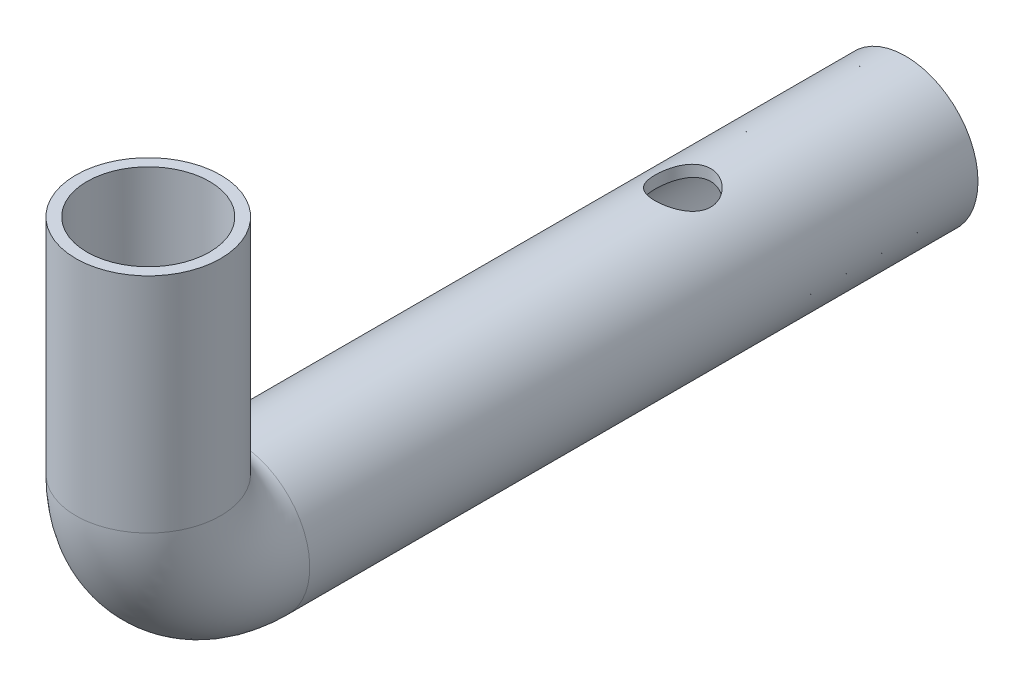
ISO-10303-21;
HEADER;
FILE_DESCRIPTION(('STEP AP214'),'2;1');
FILE_NAME('part.step','',(''),(''),'','','');
FILE_SCHEMA(('AUTOMOTIVE_DESIGN { 1 0 10303 214 1 1 1 1 }'));
ENDSEC;
DATA;
#1=APPLICATION_CONTEXT('core data for automotive mechanical design processes');
#2=APPLICATION_PROTOCOL_DEFINITION('international standard','automotive_design',2000,#1);
#3=PRODUCT_CONTEXT('',#1,'mechanical');
#4=PRODUCT('Part','Part','',(#3));
#5=PRODUCT_RELATED_PRODUCT_CATEGORY('part','',(#4));
#6=PRODUCT_DEFINITION_FORMATION('','',#4);
#7=PRODUCT_DEFINITION_CONTEXT('part definition',#1,'design');
#8=PRODUCT_DEFINITION('design','',#6,#7);
#9=PRODUCT_DEFINITION_SHAPE('','',#8);
#10=(LENGTH_UNIT() NAMED_UNIT(*) SI_UNIT(.MILLI.,.METRE.));
#11=(NAMED_UNIT(*) PLANE_ANGLE_UNIT() SI_UNIT($,.RADIAN.));
#12=(NAMED_UNIT(*) SI_UNIT($,.STERADIAN.) SOLID_ANGLE_UNIT());
#13=UNCERTAINTY_MEASURE_WITH_UNIT(LENGTH_MEASURE(1.E-05),#10,'distance_accuracy_value','');
#14=(GEOMETRIC_REPRESENTATION_CONTEXT(3) GLOBAL_UNCERTAINTY_ASSIGNED_CONTEXT((#13)) GLOBAL_UNIT_ASSIGNED_CONTEXT((#10,
#11,#12)) REPRESENTATION_CONTEXT('',''));
#15=CARTESIAN_POINT('',(0.,0.,0.));
#16=DIRECTION('',(0.,0.,1.));
#17=DIRECTION('',(1.,0.,0.));
#18=AXIS2_PLACEMENT_3D('',#15,#16,#17);
#19=CARTESIAN_POINT('',(0.,0.,0.));
#20=DIRECTION('',(0.,0.,1.));
#21=DIRECTION('',(0.,-1.,0.));
#22=AXIS2_PLACEMENT_3D('',#19,#20,#21);
#23=CYLINDRICAL_SURFACE('',#22,6.5);
#24=CARTESIAN_POINT('',(0.,0.,60.));
#25=DIRECTION('',(0.,0.,-1.));
#26=DIRECTION('',(0.,1.,0.));
#27=AXIS2_PLACEMENT_3D('',#24,#25,#26);
#28=CIRCLE('',#27,6.5);
#29=CARTESIAN_POINT('',(0.,-6.50000000000001,60.));
#30=VERTEX_POINT('',#29);
#31=EDGE_CURVE('E77',#30,#30,#28,.T.);
#32=ORIENTED_EDGE('',*,*,#31,.T.);
#33=EDGE_LOOP('',(#32));
#34=FACE_BOUND('',#33,.T.);
#35=CARTESIAN_POINT('',(0.,0.,0.));
#36=DIRECTION('',(0.,0.,-1.));
#37=DIRECTION('',(0.,1.,0.));
#38=AXIS2_PLACEMENT_3D('',#35,#36,#37);
#39=CIRCLE('',#38,6.5);
#40=CARTESIAN_POINT('',(0.,6.5,0.));
#41=VERTEX_POINT('',#40);
#42=EDGE_CURVE('E138',#41,#41,#39,.T.);
#43=ORIENTED_EDGE('',*,*,#42,.F.);
#44=EDGE_LOOP('',(#43));
#45=FACE_BOUND('',#44,.T.);
#46=CARTESIAN_POINT('',(0.,-6.5,17.5));
#47=CARTESIAN_POINT('',(0.13514306397447,-6.500004629863,17.4999939273656));
#48=CARTESIAN_POINT('',(0.270245683690177,-6.49574921829708,17.5109920103322));
#49=CARTESIAN_POINT('',(0.536399893676355,-6.47920060501405,17.5545046796923));
#50=CARTESIAN_POINT('',(0.667452289329331,-6.46690901219325,17.5870149592184));
#51=CARTESIAN_POINT('',(0.9216280032252,-6.43560329326638,17.6722230931575));
#52=CARTESIAN_POINT('',(1.04476653465277,-6.41660255099367,17.7248807736205));
#53=CARTESIAN_POINT('',(1.28044908901321,-6.3737599269311,17.8486790867224));
#54=CARTESIAN_POINT('',(1.39299010958969,-6.34991667922571,17.919824935867));
#55=CARTESIAN_POINT('',(1.60927258674544,-6.29865787982818,18.0818695715037));
#56=CARTESIAN_POINT('',(1.71248272971103,-6.27113765392606,18.1734440616638));
#57=CARTESIAN_POINT('',(1.90251373412529,-6.21612788263757,18.3723120888079));
#58=CARTESIAN_POINT('',(1.98932919333357,-6.18863835032093,18.4796107864902));
#59=CARTESIAN_POINT('',(2.14757341678641,-6.13556746669898,18.7121749791886));
#60=CARTESIAN_POINT('',(2.21823663101441,-6.11010848455126,18.8379921285933));
#61=CARTESIAN_POINT('',(2.33716189177337,-6.06561918541038,19.1008566598219));
#62=CARTESIAN_POINT('',(2.38543341568332,-6.04658614953798,19.2378992614743));
#63=CARTESIAN_POINT('',(2.45608262902037,-6.01822730812514,19.513196736226));
#64=CARTESIAN_POINT('',(2.47947801200992,-6.00852169181304,19.6511499533078));
#65=CARTESIAN_POINT('',(2.50289199475193,-5.99880894830526,19.929339459977));
#66=CARTESIAN_POINT('',(2.50292090442516,-5.99879754376073,20.0695747153534));
#67=CARTESIAN_POINT('',(2.48037656312943,-6.00814837573631,20.3388642581518));
#68=CARTESIAN_POINT('',(2.45923795706445,-6.01691562933088,20.4680632129148));
#69=CARTESIAN_POINT('',(2.39733806133434,-6.04184340382832,20.7209150794066));
#70=CARTESIAN_POINT('',(2.35657365742926,-6.05800509806771,20.8445671075386));
#71=CARTESIAN_POINT('',(2.25582663922901,-6.09624370169108,21.0856583117823));
#72=CARTESIAN_POINT('',(2.19548450476653,-6.1184298919496,21.2029291522169));
#73=CARTESIAN_POINT('',(2.05754611602823,-6.16618367671209,21.4260878785016));
#74=CARTESIAN_POINT('',(1.97994369235949,-6.19175247894498,21.5319716741229));
#75=CARTESIAN_POINT('',(1.80320515332933,-6.24560345180463,21.7372591612457));
#76=CARTESIAN_POINT('',(1.70293144449403,-6.27394938839792,21.83566921961));
#77=CARTESIAN_POINT('',(1.48698639045576,-6.32860686825818,22.0145806692835));
#78=CARTESIAN_POINT('',(1.37131243202998,-6.35491806505566,22.0950790150006));
#79=CARTESIAN_POINT('',(1.12520910755081,-6.4031140673231,22.2370550482149));
#80=CARTESIAN_POINT('',(0.994562099156594,-6.42491590699446,22.2981856575932));
#81=CARTESIAN_POINT('',(0.723789666413505,-6.46101701436,22.3972661025489));
#82=CARTESIAN_POINT('',(0.583668713964964,-6.47531979423949,22.4352267911306));
#83=CARTESIAN_POINT('',(0.306275874042356,-6.49418523125043,22.4849421817623));
#84=CARTESIAN_POINT('',(0.16927717725372,-6.49924422048434,22.4980338789584));
#85=CARTESIAN_POINT('',(-0.105038056069671,-6.50059706095232,22.5015534380367));
#86=CARTESIAN_POINT('',(-0.242354510117281,-6.49689297696438,22.491986638772));
#87=CARTESIAN_POINT('',(-0.507523391484589,-6.4814625265296,22.4514649156598));
#88=CARTESIAN_POINT('',(-0.635533278632625,-6.47007006377642,22.4213996939687));
#89=CARTESIAN_POINT('',(-0.884591112419543,-6.44074795216429,22.3419207694987));
#90=CARTESIAN_POINT('',(-1.0056381538334,-6.42281745552311,22.2925045574291));
#91=CARTESIAN_POINT('',(-1.24139762727352,-6.38151162872813,22.1741323847667));
#92=CARTESIAN_POINT('',(-1.35581229097729,-6.35798948099244,22.1046361856224));
#93=CARTESIAN_POINT('',(-1.57174720946057,-6.30808313000719,21.9486828718725));
#94=CARTESIAN_POINT('',(-1.67326251243974,-6.28169783481671,21.8622192760433));
#95=CARTESIAN_POINT('',(-1.86700866345895,-6.22695982329863,21.6685802493167));
#96=CARTESIAN_POINT('',(-1.95829399903938,-6.19858535620119,21.5604624610308));
#97=CARTESIAN_POINT('',(-2.12162980756564,-6.14459987855307,21.329904597358));
#98=CARTESIAN_POINT('',(-2.19367804771028,-6.11898918899244,21.2074628617964));
#99=CARTESIAN_POINT('',(-2.31670165885943,-6.07348698871133,20.950423952603));
#100=CARTESIAN_POINT('',(-2.36754575072591,-6.05363133271637,20.8157571607653));
#101=CARTESIAN_POINT('',(-2.44547862786552,-6.02257652756719,20.5387893944966));
#102=CARTESIAN_POINT('',(-2.47258316364823,-6.01137163946424,20.39649354834));
#103=CARTESIAN_POINT('',(-2.50082210532946,-5.99967502686126,20.1186113991318));
#104=CARTESIAN_POINT('',(-2.50357962943263,-5.99851384313484,19.9832169809304));
#105=CARTESIAN_POINT('',(-2.48724412852084,-6.00530547478505,19.7139989075653));
#106=CARTESIAN_POINT('',(-2.4681534084365,-6.01325732876099,19.5801750882123));
#107=CARTESIAN_POINT('',(-2.40995136741685,-6.03680892276013,19.3225039371973));
#108=CARTESIAN_POINT('',(-2.37153828396777,-6.05214118297217,19.1984722976881));
#109=CARTESIAN_POINT('',(-2.27641115159598,-6.08855756315716,18.9585502065407));
#110=CARTESIAN_POINT('',(-2.21969236739862,-6.1096431711739,18.8426618708484));
#111=CARTESIAN_POINT('',(-2.08599319505102,-6.15661478314378,18.6154646964258));
#112=CARTESIAN_POINT('',(-2.00807939428015,-6.18269935662048,18.5047467585243));
#113=CARTESIAN_POINT('',(-1.83561573990325,-6.23607706100414,18.297440282091));
#114=CARTESIAN_POINT('',(-1.74106046198839,-6.2633705837922,18.2008563694186));
#115=CARTESIAN_POINT('',(-1.53143830219016,-6.31799605166972,18.018824624031));
#116=CARTESIAN_POINT('',(-1.41549882935315,-6.34523808084889,17.9343499410604));
#117=CARTESIAN_POINT('',(-1.17010716237063,-6.39503827616325,17.7860891403572));
#118=CARTESIAN_POINT('',(-1.04065270472818,-6.41759565581366,17.7223064955093));
#119=CARTESIAN_POINT('',(-0.762900842232431,-6.4566913943766,17.6142955809813));
#120=CARTESIAN_POINT('',(-0.613925037531385,-6.47274070554298,17.571615623945));
#121=CARTESIAN_POINT('',(-0.309946097844235,-6.49438936244195,17.5144793950754));
#122=CARTESIAN_POINT('',(-0.154946466000344,-6.49999469169273,17.5000069624975));
#123=CARTESIAN_POINT('',(0.,-6.5,17.5));
#124=B_SPLINE_CURVE_WITH_KNOTS('',3,(#46,#47,#48,#49,#50,#51,#52,#53,#54,#55,#56,#57,#58,#59,
#60,#61,#62,#63,#64,#65,#66,#67,#68,#69,#70,#71,#72,#73,#74,#75,#76,#77,#78,#79,#80,#81,#82,#83,
#84,#85,#86,#87,#88,#89,#90,#91,#92,#93,#94,#95,#96,#97,#98,#99,#100,#101,#102,#103,#104,#105,
#106,#107,#108,#109,#110,#111,#112,#113,#114,#115,#116,#117,#118,#119,#120,#121,#122,#123),
.UNSPECIFIED.,.T.,.F.,(4,2,2,2,2,2,2,2,2,2,2,2,2,2,2,2,2,2,2,2,2,2,2,2,2,2,2,2,2,2,2,2,2,2,2,2,
2,2,4),(0.,0.404857395673177,0.809633761045267,1.21360717298344,1.61769469151936,
2.03792903302866,2.45830160597868,2.89569907712733,3.33291124861789,3.75145366078396,
4.16981140060331,4.56161223088491,4.95347525299002,5.35298551114875,5.75263879750164,
6.18066348321894,6.60876089197115,7.04414506400745,7.47932514126757,7.89036278979613,
8.30130359821627,8.6954568641467,9.08966125783838,9.4956566096056,9.90180734683234,
10.3327599285419,10.7637625081092,11.1973952581665,11.6307400870075,12.0349578310579,
12.4391329351611,12.8296520191847,13.2202722028207,13.6321153154032,14.0440929181879,
14.4800085178991,14.9159972424678,15.3804472276237,15.8446310403091),.UNSPECIFIED.);
#125=CARTESIAN_POINT('',(0.,-6.5,17.5));
#126=VERTEX_POINT('',#125);
#127=EDGE_CURVE('E106',#126,#126,#124,.T.);
#128=ORIENTED_EDGE('',*,*,#127,.F.);
#129=EDGE_LOOP('',(#128));
#130=FACE_BOUND('',#129,.T.);
#131=CARTESIAN_POINT('',(0.,6.5,17.5));
#132=CARTESIAN_POINT('',(-0.13514306397447,6.50000462986299,17.4999939273656));
#133=CARTESIAN_POINT('',(-0.270245683690178,6.49574921829707,17.5109920103322));
#134=CARTESIAN_POINT('',(-0.536399893676355,6.47920060501405,17.5545046796923));
#135=CARTESIAN_POINT('',(-0.667452289329332,6.46690901219325,17.5870149592184));
#136=CARTESIAN_POINT('',(-0.921628003225201,6.43560329326637,17.6722230931575));
#137=CARTESIAN_POINT('',(-1.04476653465277,6.41660255099367,17.7248807736205));
#138=CARTESIAN_POINT('',(-1.28044908901321,6.3737599269311,17.8486790867224));
#139=CARTESIAN_POINT('',(-1.39299010958969,6.34991667922571,17.919824935867));
#140=CARTESIAN_POINT('',(-1.60927258674544,6.29865787982817,18.0818695715037));
#141=CARTESIAN_POINT('',(-1.71248272971103,6.27113765392606,18.1734440616638));
#142=CARTESIAN_POINT('',(-1.90251373412529,6.21612788263757,18.3723120888079));
#143=CARTESIAN_POINT('',(-1.98932919333357,6.18863835032093,18.4796107864902));
#144=CARTESIAN_POINT('',(-2.14757341678641,6.13556746669897,18.7121749791886));
#145=CARTESIAN_POINT('',(-2.21823663101441,6.11010848455125,18.8379921285933));
#146=CARTESIAN_POINT('',(-2.33716189177337,6.06561918541038,19.1008566598219));
#147=CARTESIAN_POINT('',(-2.38543341568332,6.04658614953798,19.2378992614743));
#148=CARTESIAN_POINT('',(-2.45608262902037,6.01822730812514,19.513196736226));
#149=CARTESIAN_POINT('',(-2.47947801200992,6.00852169181304,19.6511499533078));
#150=CARTESIAN_POINT('',(-2.50289199475193,5.99880894830526,19.929339459977));
#151=CARTESIAN_POINT('',(-2.50292090442516,5.99879754376073,20.0695747153534));
#152=CARTESIAN_POINT('',(-2.48037656312943,6.0081483757363,20.3388642581518));
#153=CARTESIAN_POINT('',(-2.45923795706445,6.01691562933087,20.4680632129148));
#154=CARTESIAN_POINT('',(-2.39733806133434,6.04184340382831,20.7209150794066));
#155=CARTESIAN_POINT('',(-2.35657365742926,6.05800509806771,20.8445671075386));
#156=CARTESIAN_POINT('',(-2.25582663922901,6.09624370169107,21.0856583117823));
#157=CARTESIAN_POINT('',(-2.19548450476653,6.11842989194959,21.2029291522169));
#158=CARTESIAN_POINT('',(-2.05754611602823,6.16618367671208,21.4260878785016));
#159=CARTESIAN_POINT('',(-1.97994369235949,6.19175247894497,21.5319716741229));
#160=CARTESIAN_POINT('',(-1.80320515332933,6.24560345180462,21.7372591612457));
#161=CARTESIAN_POINT('',(-1.70293144449403,6.27394938839791,21.83566921961));
#162=CARTESIAN_POINT('',(-1.48698639045577,6.32860686825818,22.0145806692835));
#163=CARTESIAN_POINT('',(-1.37131243202998,6.35491806505565,22.0950790150006));
#164=CARTESIAN_POINT('',(-1.12520910755081,6.40311406732309,22.2370550482149));
#165=CARTESIAN_POINT('',(-0.994562099156594,6.42491590699446,22.2981856575932));
#166=CARTESIAN_POINT('',(-0.723789666413505,6.46101701436,22.3972661025489));
#167=CARTESIAN_POINT('',(-0.583668713964963,6.47531979423948,22.4352267911306));
#168=CARTESIAN_POINT('',(-0.306275874042356,6.49418523125042,22.4849421817623));
#169=CARTESIAN_POINT('',(-0.16927717725372,6.49924422048433,22.4980338789584));
#170=CARTESIAN_POINT('',(0.105038056069671,6.50059706095231,22.5015534380367));
#171=CARTESIAN_POINT('',(0.242354510117282,6.49689297696437,22.491986638772));
#172=CARTESIAN_POINT('',(0.50752339148459,6.48146252652959,22.4514649156598));
#173=CARTESIAN_POINT('',(0.635533278632626,6.47007006377642,22.4213996939687));
#174=CARTESIAN_POINT('',(0.884591112419543,6.44074795216429,22.3419207694987));
#175=CARTESIAN_POINT('',(1.0056381538334,6.4228174555231,22.2925045574291));
#176=CARTESIAN_POINT('',(1.24139762727352,6.38151162872812,22.1741323847667));
#177=CARTESIAN_POINT('',(1.35581229097729,6.35798948099243,22.1046361856224));
#178=CARTESIAN_POINT('',(1.57174720946057,6.30808313000719,21.9486828718725));
#179=CARTESIAN_POINT('',(1.67326251243974,6.28169783481671,21.8622192760433));
#180=CARTESIAN_POINT('',(1.86700866345895,6.22695982329862,21.6685802493167));
#181=CARTESIAN_POINT('',(1.95829399903938,6.19858535620119,21.5604624610308));
#182=CARTESIAN_POINT('',(2.12162980756564,6.14459987855306,21.329904597358));
#183=CARTESIAN_POINT('',(2.19367804771028,6.11898918899243,21.2074628617964));
#184=CARTESIAN_POINT('',(2.31670165885943,6.07348698871133,20.950423952603));
#185=CARTESIAN_POINT('',(2.36754575072591,6.05363133271636,20.8157571607653));
#186=CARTESIAN_POINT('',(2.44547862786552,6.02257652756718,20.5387893944966));
#187=CARTESIAN_POINT('',(2.47258316364823,6.01137163946424,20.39649354834));
#188=CARTESIAN_POINT('',(2.50082210532946,5.99967502686125,20.1186113991318));
#189=CARTESIAN_POINT('',(2.50357962943263,5.99851384313483,19.9832169809304));
#190=CARTESIAN_POINT('',(2.48724412852084,6.00530547478504,19.7139989075653));
#191=CARTESIAN_POINT('',(2.4681534084365,6.01325732876098,19.5801750882123));
#192=CARTESIAN_POINT('',(2.40995136741685,6.03680892276012,19.3225039371973));
#193=CARTESIAN_POINT('',(2.37153828396777,6.05214118297217,19.1984722976881));
#194=CARTESIAN_POINT('',(2.27641115159598,6.08855756315716,18.9585502065407));
#195=CARTESIAN_POINT('',(2.21969236739862,6.10964317117389,18.8426618708484));
#196=CARTESIAN_POINT('',(2.08599319505102,6.15661478314377,18.6154646964258));
#197=CARTESIAN_POINT('',(2.00807939428015,6.18269935662047,18.5047467585243));
#198=CARTESIAN_POINT('',(1.83561573990325,6.23607706100413,18.297440282091));
#199=CARTESIAN_POINT('',(1.74106046198838,6.2633705837922,18.2008563694186));
#200=CARTESIAN_POINT('',(1.53143830219016,6.31799605166971,18.018824624031));
#201=CARTESIAN_POINT('',(1.41549882935314,6.34523808084888,17.9343499410604));
#202=CARTESIAN_POINT('',(1.17010716237063,6.39503827616325,17.7860891403572));
#203=CARTESIAN_POINT('',(1.04065270472818,6.41759565581366,17.7223064955093));
#204=CARTESIAN_POINT('',(0.762900842232431,6.4566913943766,17.6142955809813));
#205=CARTESIAN_POINT('',(0.613925037531385,6.47274070554298,17.571615623945));
#206=CARTESIAN_POINT('',(0.309946097844235,6.49438936244195,17.5144793950754));
#207=CARTESIAN_POINT('',(0.154946466000344,6.49999469169272,17.5000069624975));
#208=CARTESIAN_POINT('',(0.,6.5,17.5));
#209=B_SPLINE_CURVE_WITH_KNOTS('',3,(#131,#132,#133,#134,#135,#136,#137,#138,#139,#140,#141,
#142,#143,#144,#145,#146,#147,#148,#149,#150,#151,#152,#153,#154,#155,#156,#157,#158,#159,#160,
#161,#162,#163,#164,#165,#166,#167,#168,#169,#170,#171,#172,#173,#174,#175,#176,#177,#178,#179,
#180,#181,#182,#183,#184,#185,#186,#187,#188,#189,#190,#191,#192,#193,#194,#195,#196,#197,#198,
#199,#200,#201,#202,#203,#204,#205,#206,#207,#208),.UNSPECIFIED.,.T.,.F.,(4,2,2,2,2,2,2,2,2,2,2,
2,2,2,2,2,2,2,2,2,2,2,2,2,2,2,2,2,2,2,2,2,2,2,2,2,2,2,4),(0.,0.404857395673178,
0.809633761045268,1.21360717298344,1.61769469151936,2.03792903302866,2.45830160597868,
2.89569907712733,3.33291124861789,3.75145366078396,4.16981140060331,4.56161223088491,
4.95347525299002,5.35298551114875,5.75263879750164,6.18066348321893,6.60876089197115,
7.04414506400745,7.47932514126757,7.89036278979613,8.30130359821627,8.6954568641467,
9.08966125783838,9.49565660960561,9.90180734683235,10.3327599285419,10.7637625081092,
11.1973952581665,11.6307400870075,12.0349578310579,12.4391329351611,12.8296520191847,
13.2202722028207,13.6321153154032,14.0440929181879,14.4800085178991,14.9159972424678,
15.3804472276237,15.8446310403091),.UNSPECIFIED.);
#210=CARTESIAN_POINT('',(0.,6.5,17.5));
#211=VERTEX_POINT('',#210);
#212=EDGE_CURVE('E101',#211,#211,#209,.T.);
#213=ORIENTED_EDGE('',*,*,#212,.F.);
#214=EDGE_LOOP('',(#213));
#215=FACE_BOUND('',#214,.T.);
#216=ADVANCED_FACE('F59',(#34,#45,#130,#215),#23,.T.);
#217=CARTESIAN_POINT('',(0.,0.,-4.99999999999997));
#218=DIRECTION('',(0.,0.,1.));
#219=DIRECTION('',(0.,-1.,0.));
#220=AXIS2_PLACEMENT_3D('',#217,#218,#219);
#221=CYLINDRICAL_SURFACE('',#220,5.5);
#222=CARTESIAN_POINT('',(0.,5.5,17.5));
#223=CARTESIAN_POINT('',(-0.132816145284357,5.49999369870931,17.5000077065797));
#224=CARTESIAN_POINT('',(-0.265835701448803,5.495135261146,17.5106470885147));
#225=CARTESIAN_POINT('',(-0.528027896062537,5.47618102046917,17.5527770858504));
#226=CARTESIAN_POINT('',(-0.657190881556424,5.46206378775658,17.584316075421));
#227=CARTESIAN_POINT('',(-0.907466739557298,5.42608787981103,17.6668054471522));
#228=CARTESIAN_POINT('',(-1.02860698228922,5.40425732698846,17.717685363634));
#229=CARTESIAN_POINT('',(-1.26049169700434,5.35492606344154,17.8370894193553));
#230=CARTESIAN_POINT('',(-1.37123824747009,5.32742648991281,17.9056100205893));
#231=CARTESIAN_POINT('',(-1.58575279564469,5.26767788661504,18.0624859247332));
#232=CARTESIAN_POINT('',(-1.68884771841107,5.23525516065229,18.1516946776079));
#233=CARTESIAN_POINT('',(-1.87921167122033,5.169981608249,18.345598910123));
#234=CARTESIAN_POINT('',(-1.96647083094,5.13713052839629,18.450303975207));
#235=CARTESIAN_POINT('',(-2.12798843737884,5.07244492450594,18.6799449421281));
#236=CARTESIAN_POINT('',(-2.20112759491811,5.04079497957299,18.8057258070509));
#237=CARTESIAN_POINT('',(-2.32491325493927,4.98491966737432,19.069432019188));
#238=CARTESIAN_POINT('',(-2.37557345021863,4.96068978306032,19.2073499117434));
#239=CARTESIAN_POINT('',(-2.45005627758752,4.9243140427224,19.483695485633));
#240=CARTESIAN_POINT('',(-2.47518302941618,4.91158514421169,19.621691580735));
#241=CARTESIAN_POINT('',(-2.50193279260797,4.89801821463239,19.900481945416));
#242=CARTESIAN_POINT('',(-2.50357264087074,4.89717166555205,20.0412741380636));
#243=CARTESIAN_POINT('',(-2.48427141198996,4.90698153027191,20.3074107202633));
#244=CARTESIAN_POINT('',(-2.46545016283118,4.91655818122591,20.4329573295588));
#245=CARTESIAN_POINT('',(-2.4093676508794,4.94428109958009,20.6788660765093));
#246=CARTESIAN_POINT('',(-2.37210198697065,4.96242941226084,20.7992269693191));
#247=CARTESIAN_POINT('',(-2.27945184779561,5.0056720821879,21.0346365798882));
#248=CARTESIAN_POINT('',(-2.22367420519436,5.03091516285485,21.1495019860108));
#249=CARTESIAN_POINT('',(-2.09586859273949,5.08548488907163,21.3687414552682));
#250=CARTESIAN_POINT('',(-2.02383365211919,5.11481328424216,21.4731109901751));
#251=CARTESIAN_POINT('',(-1.85692478057703,5.17789221587211,21.679646565224));
#252=CARTESIAN_POINT('',(-1.76046753299936,5.2117880598316,21.7804927335346));
#253=CARTESIAN_POINT('',(-1.55174815249174,5.27769368397502,21.9650682732868));
#254=CARTESIAN_POINT('',(-1.43948082103431,5.30970283886444,22.0487919923865));
#255=CARTESIAN_POINT('',(-1.19766281925566,5.36950534618766,22.1992066839596));
#256=CARTESIAN_POINT('',(-1.06767206685173,5.39712978524095,22.2652624790237));
#257=CARTESIAN_POINT('',(-0.796844896081459,5.44369936052483,22.374088395879));
#258=CARTESIAN_POINT('',(-0.656015701378205,5.46265022004357,22.4168738761798));
#259=CARTESIAN_POINT('',(-0.378449914355491,5.48860490400602,22.4749553693635));
#260=CARTESIAN_POINT('',(-0.242154484202897,5.4963739476775,22.4920163992086));
#261=CARTESIAN_POINT('',(0.0315660436282497,5.50161007334277,22.5035468844609));
#262=CARTESIAN_POINT('',(0.168990715716222,5.49908087348691,22.4980244935422));
#263=CARTESIAN_POINT('',(0.432146778493066,5.48448407938737,22.4657141909571));
#264=CARTESIAN_POINT('',(0.558078127396232,5.47301153257062,22.4402524784606));
#265=CARTESIAN_POINT('',(0.803693463481533,5.44237110560926,22.3707326738744));
#266=CARTESIAN_POINT('',(0.923376701955515,5.42320230560714,22.3266723588442));
#267=CARTESIAN_POINT('',(1.15732747516372,5.37821815950353,22.2198302519179));
#268=CARTESIAN_POINT('',(1.27131180951637,5.35221506502489,22.1565100651236));
#269=CARTESIAN_POINT('',(1.48744614928834,5.29622400098564,22.013532445334));
#270=CARTESIAN_POINT('',(1.58959093424205,5.26623428600456,21.9338678480869));
#271=CARTESIAN_POINT('',(1.78819128612951,5.2023213866395,21.752689346875));
#272=CARTESIAN_POINT('',(1.88345063650186,5.16827928194193,21.6499031092504));
#273=CARTESIAN_POINT('',(2.05579555974773,5.10218027178943,21.4294376337599));
#274=CARTESIAN_POINT('',(2.13287371467411,5.0701241805496,21.3117523470552));
#275=CARTESIAN_POINT('',(2.26851417742739,5.01093675854131,21.0605458311663));
#276=CARTESIAN_POINT('',(2.32651178086012,4.98396428661225,20.926679255798));
#277=CARTESIAN_POINT('',(2.41857144488096,4.93995555801825,20.6494505865758));
#278=CARTESIAN_POINT('',(2.45265831910444,4.9229090037493,20.5060985060387));
#279=CARTESIAN_POINT('',(2.49325807507769,4.90246200756535,20.2274373803254));
#280=CARTESIAN_POINT('',(2.5019188531559,4.89799994349808,20.0925190773978));
#281=CARTESIAN_POINT('',(2.49737021161821,4.90032179261342,19.8231669085299));
#282=CARTESIAN_POINT('',(2.48416607010203,4.90710299172004,19.6887329335253));
#283=CARTESIAN_POINT('',(2.4381684933062,4.93010341873286,19.4333737038628));
#284=CARTESIAN_POINT('',(2.40671995185147,4.94567287009983,19.3121413812433));
#285=CARTESIAN_POINT('',(2.32658661605855,4.98386936157557,19.0767071857297));
#286=CARTESIAN_POINT('',(2.2778967772596,5.00649846696794,18.9625073819024));
#287=CARTESIAN_POINT('',(2.1610419547488,5.05808484439916,18.7362129609708));
#288=CARTESIAN_POINT('',(2.09181431853015,5.08735847849272,18.6247408828974));
#289=CARTESIAN_POINT('',(1.93719380028804,5.14822130854099,18.4143312907205));
#290=CARTESIAN_POINT('',(1.85179378769227,5.17981152212113,18.3153993379332));
#291=CARTESIAN_POINT('',(1.65784520472974,5.2452790147138,18.1233397986651));
#292=CARTESIAN_POINT('',(1.54788097332245,5.27909503785502,18.0316125944295));
#293=CARTESIAN_POINT('',(1.31300676588176,5.34236067072088,17.8677385107735));
#294=CARTESIAN_POINT('',(1.18808990453652,5.3718082548044,17.7956007021409));
#295=CARTESIAN_POINT('',(0.927398695048435,5.42285296457391,17.6739787097551));
#296=CARTESIAN_POINT('',(0.791729654695488,5.44451694348196,17.6243006157715));
#297=CARTESIAN_POINT('',(0.582817222347261,5.46948623676269,17.5678108253949));
#298=CARTESIAN_POINT('',(0.512336727590822,5.4765522405717,17.5519909141962));
#299=CARTESIAN_POINT('',(0.370074071775206,5.48799750884364,17.526489889518));
#300=CARTESIAN_POINT('',(0.298292830256237,5.49237860050235,17.5168046010185));
#301=CARTESIAN_POINT('',(0.188612294978529,5.49689395714262,17.5068391368474));
#302=CARTESIAN_POINT('',(0.150946407387661,5.49805724033138,17.5042761390959));
#303=CARTESIAN_POINT('',(0.0755258311084193,5.49961116371431,17.5008554617096));
#304=CARTESIAN_POINT('',(0.0377711410607122,5.50000179200306,17.4999978083515));
#305=CARTESIAN_POINT('',(0.,5.5,17.5));
#306=B_SPLINE_CURVE_WITH_KNOTS('',3,(#222,#223,#224,#225,#226,#227,#228,#229,#230,#231,#232,
#233,#234,#235,#236,#237,#238,#239,#240,#241,#242,#243,#244,#245,#246,#247,#248,#249,#250,#251,
#252,#253,#254,#255,#256,#257,#258,#259,#260,#261,#262,#263,#264,#265,#266,#267,#268,#269,#270,
#271,#272,#273,#274,#275,#276,#277,#278,#279,#280,#281,#282,#283,#284,#285,#286,#287,#288,#289,
#290,#291,#292,#293,#294,#295,#296,#297,#298,#299,#300,#301,#302,#303,#304,#305),.UNSPECIFIED.,
.T.,.F.,(4,2,2,2,2,2,2,2,2,2,2,2,2,2,2,2,2,2,2,2,2,2,2,2,2,2,2,2,2,2,2,2,2,2,2,2,2,2,2,2,2,4),
(0.,0.398300931001202,0.797527003400661,1.19531228574912,1.59301785057736,2.01163405819865,
2.43051029696777,2.8749655137827,3.31914962297436,3.73929338084823,4.15913593798614,
4.53929253779887,4.91953989247824,5.30844370198958,5.6975145826618,6.1264236824533,
6.55547414294633,6.99833839939004,7.44091000768855,7.85145915894037,8.26186009578161,
8.6470684559661,9.03232287003282,9.42952911220836,9.8269098353609,10.2576285831247,
10.6885227618009,11.1312140224167,11.5734451926766,11.9770599127743,12.3805772161773,
12.7575667492601,13.1346666732434,13.5363493613727,13.9382095697601,14.3775242869152,
14.8170420813821,15.2526891454276,15.4701654657451,15.6874936194379,15.800763348909,
15.9140348236778),.UNSPECIFIED.);
#307=CARTESIAN_POINT('',(0.,5.5,17.5));
#308=VERTEX_POINT('',#307);
#309=EDGE_CURVE('E80',#308,#308,#306,.T.);
#310=ORIENTED_EDGE('',*,*,#309,.T.);
#311=EDGE_LOOP('',(#310));
#312=FACE_BOUND('',#311,.T.);
#313=CARTESIAN_POINT('',(0.,0.,60.));
#314=DIRECTION('',(0.,0.,-1.));
#315=DIRECTION('',(0.,1.,0.));
#316=AXIS2_PLACEMENT_3D('',#313,#314,#315);
#317=CIRCLE('',#316,5.5);
#318=CARTESIAN_POINT('',(0.,-5.50000000000001,60.));
#319=VERTEX_POINT('',#318);
#320=EDGE_CURVE('E141',#319,#319,#317,.T.);
#321=ORIENTED_EDGE('',*,*,#320,.F.);
#322=EDGE_LOOP('',(#321));
#323=FACE_BOUND('',#322,.T.);
#324=CARTESIAN_POINT('',(0.,0.,0.));
#325=DIRECTION('',(0.,0.,-1.));
#326=DIRECTION('',(0.,1.,0.));
#327=AXIS2_PLACEMENT_3D('',#324,#325,#326);
#328=CIRCLE('',#327,5.5);
#329=CARTESIAN_POINT('',(0.,5.5,0.));
#330=VERTEX_POINT('',#329);
#331=EDGE_CURVE('E135',#330,#330,#328,.T.);
#332=ORIENTED_EDGE('',*,*,#331,.T.);
#333=EDGE_LOOP('',(#332));
#334=FACE_BOUND('',#333,.T.);
#335=CARTESIAN_POINT('',(0.,-5.5,17.5));
#336=CARTESIAN_POINT('',(0.132816145284357,-5.49999369870932,17.5000077065797));
#337=CARTESIAN_POINT('',(0.265835701448803,-5.49513526114601,17.5106470885147));
#338=CARTESIAN_POINT('',(0.528027896062536,-5.47618102046918,17.5527770858504));
#339=CARTESIAN_POINT('',(0.657190881556424,-5.46206378775659,17.584316075421));
#340=CARTESIAN_POINT('',(0.907466739557298,-5.42608787981103,17.6668054471522));
#341=CARTESIAN_POINT('',(1.02860698228922,-5.40425732698847,17.717685363634));
#342=CARTESIAN_POINT('',(1.26049169700434,-5.35492606344155,17.8370894193553));
#343=CARTESIAN_POINT('',(1.37123824747009,-5.32742648991282,17.9056100205893));
#344=CARTESIAN_POINT('',(1.58575279564469,-5.26767788661504,18.0624859247332));
#345=CARTESIAN_POINT('',(1.68884771841107,-5.2352551606523,18.1516946776079));
#346=CARTESIAN_POINT('',(1.87921167122033,-5.16998160824901,18.345598910123));
#347=CARTESIAN_POINT('',(1.96647083094,-5.1371305283963,18.450303975207));
#348=CARTESIAN_POINT('',(2.12798843737884,-5.07244492450595,18.6799449421281));
#349=CARTESIAN_POINT('',(2.20112759491811,-5.040794979573,18.8057258070509));
#350=CARTESIAN_POINT('',(2.32491325493927,-4.98491966737432,19.069432019188));
#351=CARTESIAN_POINT('',(2.37557345021863,-4.96068978306032,19.2073499117434));
#352=CARTESIAN_POINT('',(2.45005627758752,-4.9243140427224,19.483695485633));
#353=CARTESIAN_POINT('',(2.47518302941618,-4.91158514421169,19.621691580735));
#354=CARTESIAN_POINT('',(2.50193279260797,-4.89801821463239,19.900481945416));
#355=CARTESIAN_POINT('',(2.50357264087074,-4.89717166555205,20.0412741380636));
#356=CARTESIAN_POINT('',(2.48427141198996,-4.90698153027191,20.3074107202633));
#357=CARTESIAN_POINT('',(2.46545016283118,-4.91655818122591,20.4329573295588));
#358=CARTESIAN_POINT('',(2.4093676508794,-4.94428109958009,20.6788660765093));
#359=CARTESIAN_POINT('',(2.37210198697065,-4.96242941226085,20.7992269693191));
#360=CARTESIAN_POINT('',(2.27945184779561,-5.00567208218791,21.0346365798882));
#361=CARTESIAN_POINT('',(2.22367420519436,-5.03091516285486,21.1495019860108));
#362=CARTESIAN_POINT('',(2.09586859273949,-5.08548488907163,21.3687414552682));
#363=CARTESIAN_POINT('',(2.02383365211919,-5.11481328424216,21.4731109901751));
#364=CARTESIAN_POINT('',(1.85692478057703,-5.17789221587211,21.679646565224));
#365=CARTESIAN_POINT('',(1.76046753299936,-5.2117880598316,21.7804927335346));
#366=CARTESIAN_POINT('',(1.55174815249175,-5.27769368397502,21.9650682732868));
#367=CARTESIAN_POINT('',(1.43948082103431,-5.30970283886445,22.0487919923865));
#368=CARTESIAN_POINT('',(1.19766281925566,-5.36950534618767,22.1992066839596));
#369=CARTESIAN_POINT('',(1.06767206685173,-5.39712978524096,22.2652624790237));
#370=CARTESIAN_POINT('',(0.796844896081459,-5.44369936052484,22.374088395879));
#371=CARTESIAN_POINT('',(0.656015701378206,-5.46265022004357,22.4168738761798));
#372=CARTESIAN_POINT('',(0.378449914355492,-5.48860490400603,22.4749553693635));
#373=CARTESIAN_POINT('',(0.242154484202898,-5.49637394767751,22.4920163992086));
#374=CARTESIAN_POINT('',(-0.0315660436282488,-5.50161007334277,22.5035468844609));
#375=CARTESIAN_POINT('',(-0.168990715716221,-5.49908087348692,22.4980244935422));
#376=CARTESIAN_POINT('',(-0.432146778493066,-5.48448407938737,22.4657141909571));
#377=CARTESIAN_POINT('',(-0.558078127396232,-5.47301153257063,22.4402524784606));
#378=CARTESIAN_POINT('',(-0.803693463481532,-5.44237110560927,22.3707326738744));
#379=CARTESIAN_POINT('',(-0.923376701955514,-5.42320230560714,22.3266723588442));
#380=CARTESIAN_POINT('',(-1.15732747516372,-5.37821815950354,22.2198302519179));
#381=CARTESIAN_POINT('',(-1.27131180951637,-5.3522150650249,22.1565100651236));
#382=CARTESIAN_POINT('',(-1.48744614928834,-5.29622400098564,22.013532445334));
#383=CARTESIAN_POINT('',(-1.58959093424204,-5.26623428600456,21.9338678480869));
#384=CARTESIAN_POINT('',(-1.78819128612951,-5.2023213866395,21.752689346875));
#385=CARTESIAN_POINT('',(-1.88345063650185,-5.16827928194194,21.6499031092504));
#386=CARTESIAN_POINT('',(-2.05579555974772,-5.10218027178944,21.4294376337599));
#387=CARTESIAN_POINT('',(-2.13287371467411,-5.07012418054961,21.3117523470552));
#388=CARTESIAN_POINT('',(-2.26851417742739,-5.01093675854132,21.0605458311663));
#389=CARTESIAN_POINT('',(-2.32651178086012,-4.98396428661225,20.926679255798));
#390=CARTESIAN_POINT('',(-2.41857144488096,-4.93995555801825,20.6494505865758));
#391=CARTESIAN_POINT('',(-2.45265831910444,-4.9229090037493,20.5060985060387));
#392=CARTESIAN_POINT('',(-2.49325807507769,-4.90246200756536,20.2274373803254));
#393=CARTESIAN_POINT('',(-2.5019188531559,-4.89799994349809,20.0925190773978));
#394=CARTESIAN_POINT('',(-2.49737021161821,-4.90032179261342,19.8231669085299));
#395=CARTESIAN_POINT('',(-2.48416607010203,-4.90710299172005,19.6887329335253));
#396=CARTESIAN_POINT('',(-2.4381684933062,-4.93010341873287,19.4333737038628));
#397=CARTESIAN_POINT('',(-2.40671995185147,-4.94567287009983,19.3121413812433));
#398=CARTESIAN_POINT('',(-2.32658661605855,-4.98386936157558,19.0767071857297));
#399=CARTESIAN_POINT('',(-2.2778967772596,-5.00649846696795,18.9625073819024));
#400=CARTESIAN_POINT('',(-2.1610419547488,-5.05808484439917,18.7362129609708));
#401=CARTESIAN_POINT('',(-2.09181431853015,-5.08735847849273,18.6247408828974));
#402=CARTESIAN_POINT('',(-1.93719380028804,-5.148221308541,18.4143312907205));
#403=CARTESIAN_POINT('',(-1.85179378769227,-5.17981152212113,18.3153993379332));
#404=CARTESIAN_POINT('',(-1.65784520472974,-5.2452790147138,18.1233397986651));
#405=CARTESIAN_POINT('',(-1.54788097332246,-5.27909503785502,18.0316125944295));
#406=CARTESIAN_POINT('',(-1.31300676588176,-5.34236067072089,17.8677385107735));
#407=CARTESIAN_POINT('',(-1.18808990453652,-5.3718082548044,17.7956007021409));
#408=CARTESIAN_POINT('',(-0.927398695048435,-5.42285296457392,17.6739787097551));
#409=CARTESIAN_POINT('',(-0.791729654695488,-5.44451694348197,17.6243006157715));
#410=CARTESIAN_POINT('',(-0.58281722234726,-5.46948623676269,17.5678108253949));
#411=CARTESIAN_POINT('',(-0.512336727590822,-5.4765522405717,17.5519909141962));
#412=CARTESIAN_POINT('',(-0.370074071775206,-5.48799750884364,17.526489889518));
#413=CARTESIAN_POINT('',(-0.298292830256238,-5.49237860050235,17.5168046010185));
#414=CARTESIAN_POINT('',(-0.18861229497853,-5.49689395714262,17.5068391368474));
#415=CARTESIAN_POINT('',(-0.150946407387661,-5.49805724033138,17.5042761390959));
#416=CARTESIAN_POINT('',(-0.0755258311084194,-5.49961116371431,17.5008554617096));
#417=CARTESIAN_POINT('',(-0.0377711410607123,-5.50000179200307,17.4999978083515));
#418=CARTESIAN_POINT('',(0.,-5.5,17.5));
#419=B_SPLINE_CURVE_WITH_KNOTS('',3,(#335,#336,#337,#338,#339,#340,#341,#342,#343,#344,#345,
#346,#347,#348,#349,#350,#351,#352,#353,#354,#355,#356,#357,#358,#359,#360,#361,#362,#363,#364,
#365,#366,#367,#368,#369,#370,#371,#372,#373,#374,#375,#376,#377,#378,#379,#380,#381,#382,#383,
#384,#385,#386,#387,#388,#389,#390,#391,#392,#393,#394,#395,#396,#397,#398,#399,#400,#401,#402,
#403,#404,#405,#406,#407,#408,#409,#410,#411,#412,#413,#414,#415,#416,#417,#418),.UNSPECIFIED.,
.T.,.F.,(4,2,2,2,2,2,2,2,2,2,2,2,2,2,2,2,2,2,2,2,2,2,2,2,2,2,2,2,2,2,2,2,2,2,2,2,2,2,2,2,2,4),
(0.,0.398300931001201,0.797527003400661,1.19531228574912,1.59301785057736,2.01163405819865,
2.43051029696777,2.8749655137827,3.31914962297436,3.73929338084823,4.15913593798614,
4.53929253779887,4.91953989247824,5.30844370198958,5.6975145826618,6.1264236824533,
6.55547414294633,6.99833839939004,7.44091000768855,7.85145915894037,8.26186009578161,
8.6470684559661,9.03232287003282,9.42952911220836,9.8269098353609,10.2576285831247,
10.6885227618009,11.1312140224167,11.5734451926766,11.9770599127743,12.3805772161773,
12.7575667492601,13.1346666732434,13.5363493613727,13.9382095697602,14.3775242869152,
14.8170420813821,15.2526891454276,15.4701654657451,15.6874936194379,15.800763348909,
15.9140348236778),.UNSPECIFIED.);
#420=CARTESIAN_POINT('',(0.,-5.5,17.5));
#421=VERTEX_POINT('',#420);
#422=EDGE_CURVE('E63',#421,#421,#419,.T.);
#423=ORIENTED_EDGE('',*,*,#422,.T.);
#424=EDGE_LOOP('',(#423));
#425=FACE_BOUND('',#424,.T.);
#426=ADVANCED_FACE('F85',(#312,#323,#334,#425),#221,.F.);
#427=CARTESIAN_POINT('',(0.,0.,0.));
#428=DIRECTION('',(0.,0.,-1.));
#429=DIRECTION('',(0.,1.,0.));
#430=AXIS2_PLACEMENT_3D('',#427,#428,#429);
#431=PLANE('',#430);
#432=ORIENTED_EDGE('',*,*,#331,.F.);
#433=EDGE_LOOP('',(#432));
#434=FACE_BOUND('',#433,.T.);
#435=ORIENTED_EDGE('',*,*,#42,.T.);
#436=EDGE_LOOP('',(#435));
#437=FACE_BOUND('',#436,.T.);
#438=ADVANCED_FACE('F61',(#434,#437),#431,.T.);
#439=CARTESIAN_POINT('',(0.,28.,68.));
#440=DIRECTION('',(0.,-1.,0.));
#441=DIRECTION('',(0.,0.,-1.));
#442=AXIS2_PLACEMENT_3D('',#439,#440,#441);
#443=PLANE('',#442);
#444=CARTESIAN_POINT('',(0.,28.,68.));
#445=DIRECTION('',(0.,-1.,0.));
#446=DIRECTION('',(0.,0.,-1.));
#447=AXIS2_PLACEMENT_3D('',#444,#445,#446);
#448=CIRCLE('',#447,5.5);
#449=CARTESIAN_POINT('',(0.,28.,62.5));
#450=VERTEX_POINT('',#449);
#451=EDGE_CURVE('E133',#450,#450,#448,.T.);
#452=ORIENTED_EDGE('',*,*,#451,.T.);
#453=EDGE_LOOP('',(#452));
#454=FACE_BOUND('',#453,.T.);
#455=CARTESIAN_POINT('',(0.,28.,68.));
#456=DIRECTION('',(0.,-1.,0.));
#457=DIRECTION('',(0.,0.,-1.));
#458=AXIS2_PLACEMENT_3D('',#455,#456,#457);
#459=CIRCLE('',#458,6.5);
#460=CARTESIAN_POINT('',(0.,28.,61.5));
#461=VERTEX_POINT('',#460);
#462=EDGE_CURVE('E11',#461,#461,#459,.T.);
#463=ORIENTED_EDGE('',*,*,#462,.F.);
#464=EDGE_LOOP('',(#463));
#465=FACE_BOUND('',#464,.T.);
#466=ADVANCED_FACE('F120',(#454,#465),#443,.F.);
#467=CARTESIAN_POINT('',(0.,7.99999999999999,60.));
#468=DIRECTION('',(-1.,0.,0.));
#469=DIRECTION('',(0.,0.,1.));
#470=AXIS2_PLACEMENT_3D('',#467,#468,#469);
#471=TOROIDAL_SURFACE('',#470,8.00000000000001,6.5);
#472=CARTESIAN_POINT('',(0.,7.99999999999999,68.));
#473=DIRECTION('',(0.,-1.,0.));
#474=DIRECTION('',(0.,0.,-1.));
#475=AXIS2_PLACEMENT_3D('',#472,#473,#474);
#476=CIRCLE('',#475,6.5);
#477=CARTESIAN_POINT('',(0.,7.99999999999999,74.5));
#478=VERTEX_POINT('',#477);
#479=EDGE_CURVE('E72',#478,#478,#476,.T.);
#480=CARTESIAN_POINT('',(0.,7.99999999999999,60.));
#481=DIRECTION('',(-1.,0.,0.));
#482=DIRECTION('',(0.,0.,1.));
#483=AXIS2_PLACEMENT_3D('',#480,#481,#482);
#484=CIRCLE('',#483,14.5);
#485=EDGE_CURVE('',#30,#478,#484,.T.);
#486=ORIENTED_EDGE('',*,*,#31,.F.);
#487=ORIENTED_EDGE('',*,*,#479,.T.);
#488=ORIENTED_EDGE('',*,*,#485,.T.);
#489=ORIENTED_EDGE('',*,*,#485,.F.);
#490=EDGE_LOOP('',(#486,#488,#487,#489));
#491=FACE_BOUND('',#490,.T.);
#492=ADVANCED_FACE('F115',(#491),#471,.T.);
#493=CARTESIAN_POINT('',(0.,7.99999999999999,68.));
#494=DIRECTION('',(0.,1.,0.));
#495=DIRECTION('',(0.,0.,1.));
#496=AXIS2_PLACEMENT_3D('',#493,#494,#495);
#497=CYLINDRICAL_SURFACE('',#496,6.5);
#498=ORIENTED_EDGE('',*,*,#462,.T.);
#499=EDGE_LOOP('',(#498));
#500=FACE_BOUND('',#499,.T.);
#501=ORIENTED_EDGE('',*,*,#479,.F.);
#502=EDGE_LOOP('',(#501));
#503=FACE_BOUND('',#502,.T.);
#504=ADVANCED_FACE('F119',(#500,#503),#497,.T.);
#505=CARTESIAN_POINT('',(0.,7.99999999999999,60.));
#506=DIRECTION('',(-1.,0.,0.));
#507=DIRECTION('',(0.,0.,1.));
#508=AXIS2_PLACEMENT_3D('',#505,#506,#507);
#509=TOROIDAL_SURFACE('',#508,8.00000000000001,5.5);
#510=CARTESIAN_POINT('',(0.,7.99999999999999,68.));
#511=DIRECTION('',(0.,-1.,0.));
#512=DIRECTION('',(0.,0.,-1.));
#513=AXIS2_PLACEMENT_3D('',#510,#511,#512);
#514=CIRCLE('',#513,5.5);
#515=CARTESIAN_POINT('',(0.,7.99999999999999,73.5));
#516=VERTEX_POINT('',#515);
#517=EDGE_CURVE('E136',#516,#516,#514,.T.);
#518=CARTESIAN_POINT('',(0.,7.99999999999999,60.));
#519=DIRECTION('',(-1.,0.,0.));
#520=DIRECTION('',(0.,0.,1.));
#521=AXIS2_PLACEMENT_3D('',#518,#519,#520);
#522=CIRCLE('',#521,13.5);
#523=EDGE_CURVE('',#319,#516,#522,.T.);
#524=ORIENTED_EDGE('',*,*,#320,.T.);
#525=ORIENTED_EDGE('',*,*,#517,.F.);
#526=ORIENTED_EDGE('',*,*,#523,.T.);
#527=ORIENTED_EDGE('',*,*,#523,.F.);
#528=EDGE_LOOP('',(#524,#526,#525,#527));
#529=FACE_BOUND('',#528,.T.);
#530=ADVANCED_FACE('F123',(#529),#509,.F.);
#531=CARTESIAN_POINT('',(0.,7.99999999999999,68.));
#532=DIRECTION('',(0.,1.,0.));
#533=DIRECTION('',(0.,0.,1.));
#534=AXIS2_PLACEMENT_3D('',#531,#532,#533);
#535=CYLINDRICAL_SURFACE('',#534,5.5);
#536=ORIENTED_EDGE('',*,*,#451,.F.);
#537=EDGE_LOOP('',(#536));
#538=FACE_BOUND('',#537,.T.);
#539=ORIENTED_EDGE('',*,*,#517,.T.);
#540=EDGE_LOOP('',(#539));
#541=FACE_BOUND('',#540,.T.);
#542=ADVANCED_FACE('F95',(#538,#541),#535,.F.);
#543=CARTESIAN_POINT('',(0.,28.,20.));
#544=DIRECTION('',(0.,-1.,0.));
#545=DIRECTION('',(0.,0.,-1.));
#546=AXIS2_PLACEMENT_3D('',#543,#544,#545);
#547=CYLINDRICAL_SURFACE('',#546,2.5);
#548=ORIENTED_EDGE('',*,*,#309,.F.);
#549=EDGE_LOOP('',(#548));
#550=FACE_BOUND('',#549,.T.);
#551=ORIENTED_EDGE('',*,*,#212,.T.);
#552=EDGE_LOOP('',(#551));
#553=FACE_BOUND('',#552,.T.);
#554=ADVANCED_FACE('F93',(#550,#553),#547,.F.);
#555=ORIENTED_EDGE('',*,*,#422,.F.);
#556=EDGE_LOOP('',(#555));
#557=FACE_BOUND('',#556,.T.);
#558=ORIENTED_EDGE('',*,*,#127,.T.);
#559=EDGE_LOOP('',(#558));
#560=FACE_BOUND('',#559,.T.);
#561=ADVANCED_FACE('F89',(#557,#560),#547,.F.);
#562=CLOSED_SHELL('',(#216,#426,#438,#466,#492,#504,#530,#542,#554,#561));
#563=MANIFOLD_SOLID_BREP('B2',#562);
#564=ADVANCED_BREP_SHAPE_REPRESENTATION('',(#18,#563),#14);
#565=SHAPE_DEFINITION_REPRESENTATION(#9,#564);
ENDSEC;
END-ISO-10303-21;
